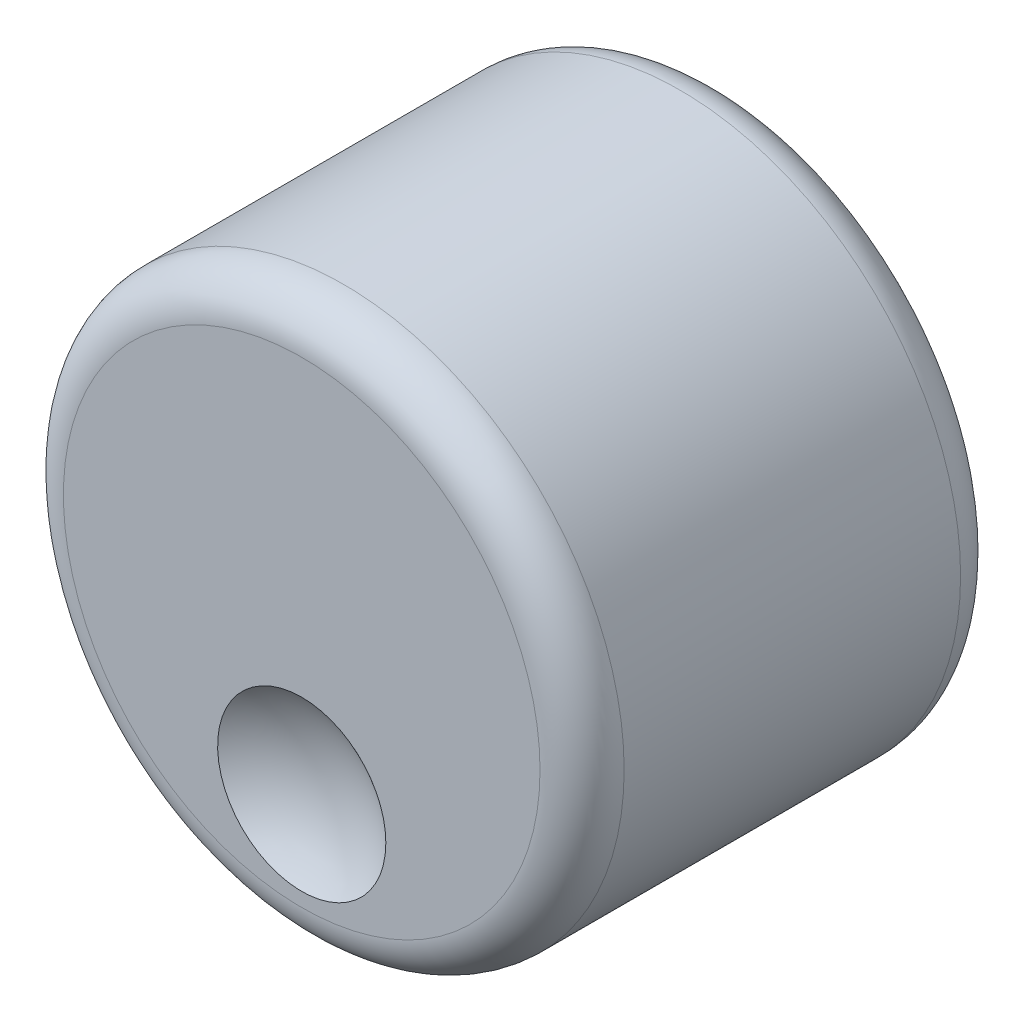
ISO-10303-21;
HEADER;
FILE_DESCRIPTION(('STEP AP214'),'2;1');
FILE_NAME('part.step','',(''),(''),'','','');
FILE_SCHEMA(('AUTOMOTIVE_DESIGN { 1 0 10303 214 1 1 1 1 }'));
ENDSEC;
DATA;
#1=APPLICATION_CONTEXT('core data for automotive mechanical design processes');
#2=APPLICATION_PROTOCOL_DEFINITION('international standard','automotive_design',2000,#1);
#3=PRODUCT_CONTEXT('',#1,'mechanical');
#4=PRODUCT('Part','Part','',(#3));
#5=PRODUCT_RELATED_PRODUCT_CATEGORY('part','',(#4));
#6=PRODUCT_DEFINITION_FORMATION('','',#4);
#7=PRODUCT_DEFINITION_CONTEXT('part definition',#1,'design');
#8=PRODUCT_DEFINITION('design','',#6,#7);
#9=PRODUCT_DEFINITION_SHAPE('','',#8);
#10=(LENGTH_UNIT() NAMED_UNIT(*) SI_UNIT(.MILLI.,.METRE.));
#11=(NAMED_UNIT(*) PLANE_ANGLE_UNIT() SI_UNIT($,.RADIAN.));
#12=(NAMED_UNIT(*) SI_UNIT($,.STERADIAN.) SOLID_ANGLE_UNIT());
#13=UNCERTAINTY_MEASURE_WITH_UNIT(LENGTH_MEASURE(1.E-05),#10,'distance_accuracy_value','');
#14=(GEOMETRIC_REPRESENTATION_CONTEXT(3) GLOBAL_UNCERTAINTY_ASSIGNED_CONTEXT((#13)) GLOBAL_UNIT_ASSIGNED_CONTEXT((#10,
#11,#12)) REPRESENTATION_CONTEXT('',''));
#15=CARTESIAN_POINT('',(0.,0.,0.));
#16=DIRECTION('',(0.,0.,1.));
#17=DIRECTION('',(1.,0.,0.));
#18=AXIS2_PLACEMENT_3D('',#15,#16,#17);
#19=CARTESIAN_POINT('',(0.,0.,15.));
#20=DIRECTION('',(0.,0.,-1.));
#21=DIRECTION('',(-1.,0.,0.));
#22=AXIS2_PLACEMENT_3D('',#19,#20,#21);
#23=CYLINDRICAL_SURFACE('',#22,10.);
#24=CARTESIAN_POINT('',(0.,0.,1.5));
#25=DIRECTION('',(0.,0.,1.));
#26=DIRECTION('',(1.,0.,0.));
#27=AXIS2_PLACEMENT_3D('',#24,#25,#26);
#28=CIRCLE('',#27,10.);
#29=CARTESIAN_POINT('',(10.,0.,1.5));
#30=VERTEX_POINT('',#29);
#31=EDGE_CURVE('E50',#30,#30,#28,.T.);
#32=ORIENTED_EDGE('',*,*,#31,.T.);
#33=EDGE_LOOP('',(#32));
#34=FACE_BOUND('',#33,.T.);
#35=CARTESIAN_POINT('',(0.,0.,13.5));
#36=DIRECTION('',(0.,0.,1.));
#37=DIRECTION('',(1.,0.,0.));
#38=AXIS2_PLACEMENT_3D('',#35,#36,#37);
#39=CIRCLE('',#38,10.);
#40=CARTESIAN_POINT('',(10.,0.,13.5));
#41=VERTEX_POINT('',#40);
#42=EDGE_CURVE('E53',#41,#41,#39,.F.);
#43=ORIENTED_EDGE('',*,*,#42,.T.);
#44=EDGE_LOOP('',(#43));
#45=FACE_BOUND('',#44,.T.);
#46=ADVANCED_FACE('F30',(#34,#45),#23,.T.);
#47=CARTESIAN_POINT('',(0.,0.,15.));
#48=DIRECTION('',(0.,0.,1.));
#49=DIRECTION('',(1.,0.,0.));
#50=AXIS2_PLACEMENT_3D('',#47,#48,#49);
#51=PLANE('',#50);
#52=CARTESIAN_POINT('',(0.,-5.,15.));
#53=DIRECTION('',(0.,0.,1.));
#54=DIRECTION('',(1.,0.,0.));
#55=AXIS2_PLACEMENT_3D('',#52,#53,#54);
#56=CIRCLE('',#55,3.);
#57=CARTESIAN_POINT('',(3.,-5.,15.));
#58=VERTEX_POINT('',#57);
#59=EDGE_CURVE('E34',#58,#58,#56,.T.);
#60=ORIENTED_EDGE('',*,*,#59,.F.);
#61=EDGE_LOOP('',(#60));
#62=FACE_BOUND('',#61,.T.);
#63=CARTESIAN_POINT('',(0.,0.,15.));
#64=DIRECTION('',(0.,0.,1.));
#65=DIRECTION('',(1.,0.,0.));
#66=AXIS2_PLACEMENT_3D('',#63,#64,#65);
#67=CIRCLE('',#66,8.5);
#68=CARTESIAN_POINT('',(8.5,0.,15.));
#69=VERTEX_POINT('',#68);
#70=EDGE_CURVE('E42',#69,#69,#67,.T.);
#71=ORIENTED_EDGE('',*,*,#70,.T.);
#72=EDGE_LOOP('',(#71));
#73=FACE_BOUND('',#72,.T.);
#74=ADVANCED_FACE('F65',(#62,#73),#51,.T.);
#75=CARTESIAN_POINT('',(0.,0.,0.));
#76=DIRECTION('',(0.,0.,1.));
#77=DIRECTION('',(1.,0.,0.));
#78=AXIS2_PLACEMENT_3D('',#75,#76,#77);
#79=PLANE('',#78);
#80=CARTESIAN_POINT('',(0.,0.,0.));
#81=DIRECTION('',(0.,0.,1.));
#82=DIRECTION('',(1.,0.,0.));
#83=AXIS2_PLACEMENT_3D('',#80,#81,#82);
#84=CIRCLE('',#83,4.);
#85=CARTESIAN_POINT('',(4.,0.,0.));
#86=VERTEX_POINT('',#85);
#87=EDGE_CURVE('E10',#86,#86,#84,.T.);
#88=ORIENTED_EDGE('',*,*,#87,.T.);
#89=EDGE_LOOP('',(#88));
#90=FACE_BOUND('',#89,.T.);
#91=CARTESIAN_POINT('',(0.,0.,0.));
#92=DIRECTION('',(0.,0.,1.));
#93=DIRECTION('',(1.,0.,0.));
#94=AXIS2_PLACEMENT_3D('',#91,#92,#93);
#95=CIRCLE('',#94,8.5);
#96=CARTESIAN_POINT('',(8.5,0.,0.));
#97=VERTEX_POINT('',#96);
#98=EDGE_CURVE('E47',#97,#97,#95,.F.);
#99=ORIENTED_EDGE('',*,*,#98,.T.);
#100=EDGE_LOOP('',(#99));
#101=FACE_BOUND('',#100,.T.);
#102=ADVANCED_FACE('F68',(#90,#101),#79,.F.);
#103=CARTESIAN_POINT('',(0.,0.,1.5));
#104=DIRECTION('',(0.,0.,1.));
#105=DIRECTION('',(1.,0.,0.));
#106=AXIS2_PLACEMENT_3D('',#103,#104,#105);
#107=TOROIDAL_SURFACE('',#106,8.5,1.5);
#108=ORIENTED_EDGE('',*,*,#98,.F.);
#109=EDGE_LOOP('',(#108));
#110=FACE_BOUND('',#109,.T.);
#111=ORIENTED_EDGE('',*,*,#31,.F.);
#112=EDGE_LOOP('',(#111));
#113=FACE_BOUND('',#112,.T.);
#114=ADVANCED_FACE('F75',(#110,#113),#107,.T.);
#115=CARTESIAN_POINT('',(0.,0.,13.5));
#116=DIRECTION('',(0.,0.,1.));
#117=DIRECTION('',(1.,0.,0.));
#118=AXIS2_PLACEMENT_3D('',#115,#116,#117);
#119=TOROIDAL_SURFACE('',#118,8.5,1.5);
#120=ORIENTED_EDGE('',*,*,#42,.F.);
#121=EDGE_LOOP('',(#120));
#122=FACE_BOUND('',#121,.T.);
#123=ORIENTED_EDGE('',*,*,#70,.F.);
#124=EDGE_LOOP('',(#123));
#125=FACE_BOUND('',#124,.T.);
#126=ADVANCED_FACE('F72',(#122,#125),#119,.T.);
#127=CARTESIAN_POINT('',(0.,0.,12.));
#128=DIRECTION('',(0.,0.,-1.));
#129=DIRECTION('',(-1.,0.,0.));
#130=AXIS2_PLACEMENT_3D('',#127,#128,#129);
#131=CYLINDRICAL_SURFACE('',#130,3.);
#132=CARTESIAN_POINT('',(0.,0.,0.999999999999997));
#133=DIRECTION('',(0.,0.,1.));
#134=DIRECTION('',(1.,0.,0.));
#135=AXIS2_PLACEMENT_3D('',#132,#133,#134);
#136=CIRCLE('',#135,3.);
#137=CARTESIAN_POINT('',(3.,0.,0.999999999999997));
#138=VERTEX_POINT('',#137);
#139=EDGE_CURVE('E38',#138,#138,#136,.F.);
#140=ORIENTED_EDGE('',*,*,#139,.T.);
#141=EDGE_LOOP('',(#140));
#142=FACE_BOUND('',#141,.T.);
#143=CARTESIAN_POINT('',(0.,0.,12.));
#144=DIRECTION('',(0.,0.,-1.));
#145=DIRECTION('',(-1.,0.,0.));
#146=AXIS2_PLACEMENT_3D('',#143,#144,#145);
#147=CIRCLE('',#146,3.);
#148=CARTESIAN_POINT('',(-3.,0.,12.));
#149=VERTEX_POINT('',#148);
#150=EDGE_CURVE('E56',#149,#149,#147,.T.);
#151=ORIENTED_EDGE('',*,*,#150,.F.);
#152=EDGE_LOOP('',(#151));
#153=FACE_BOUND('',#152,.T.);
#154=ADVANCED_FACE('F74',(#142,#153),#131,.F.);
#155=CARTESIAN_POINT('',(0.,0.,12.));
#156=DIRECTION('',(0.,0.,-1.));
#157=DIRECTION('',(-1.,0.,0.));
#158=AXIS2_PLACEMENT_3D('',#155,#156,#157);
#159=PLANE('',#158);
#160=ORIENTED_EDGE('',*,*,#150,.T.);
#161=EDGE_LOOP('',(#160));
#162=FACE_BOUND('',#161,.T.);
#163=ADVANCED_FACE('F81',(#162),#159,.T.);
#164=CARTESIAN_POINT('',(0.,0.,0.999999999999997));
#165=DIRECTION('',(0.,0.,-1.));
#166=DIRECTION('',(-1.,0.,0.));
#167=AXIS2_PLACEMENT_3D('',#164,#165,#166);
#168=CONICAL_SURFACE('',#167,3.,0.785398163397451);
#169=ORIENTED_EDGE('',*,*,#87,.F.);
#170=EDGE_LOOP('',(#169));
#171=FACE_BOUND('',#170,.T.);
#172=ORIENTED_EDGE('',*,*,#139,.F.);
#173=EDGE_LOOP('',(#172));
#174=FACE_BOUND('',#173,.T.);
#175=ADVANCED_FACE('F32',(#171,#174),#168,.F.);
#176=CARTESIAN_POINT('',(0.,-5.,19.));
#177=DIRECTION('',(0.,0.,1.));
#178=DIRECTION('',(0.,1.,0.));
#179=AXIS2_PLACEMENT_3D('',#176,#177,#178);
#180=SPHERICAL_SURFACE('',#179,5.);
#181=ORIENTED_EDGE('',*,*,#59,.T.);
#182=EDGE_LOOP('',(#181));
#183=FACE_BOUND('',#182,.T.);
#184=ADVANCED_FACE('F63',(#183),#180,.F.);
#185=CLOSED_SHELL('',(#46,#74,#102,#114,#126,#154,#163,#175,#184));
#186=MANIFOLD_SOLID_BREP('B2',#185);
#187=ADVANCED_BREP_SHAPE_REPRESENTATION('',(#18,#186),#14);
#188=SHAPE_DEFINITION_REPRESENTATION(#9,#187);
ENDSEC;
END-ISO-10303-21;
